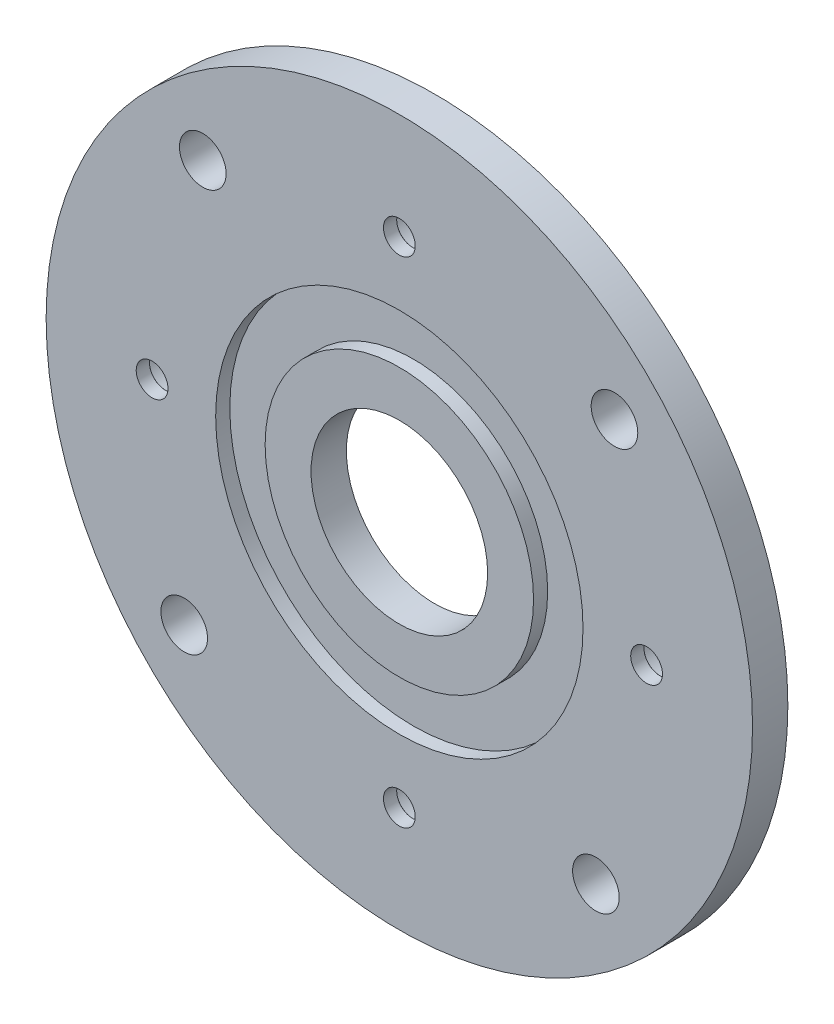
ISO-10303-21;
HEADER;
FILE_DESCRIPTION(('STEP AP214'),'2;1');
FILE_NAME('part.step','',(''),(''),'','','');
FILE_SCHEMA(('AUTOMOTIVE_DESIGN { 1 0 10303 214 1 1 1 1 }'));
ENDSEC;
DATA;
#1=APPLICATION_CONTEXT('core data for automotive mechanical design processes');
#2=APPLICATION_PROTOCOL_DEFINITION('international standard','automotive_design',2000,#1);
#3=PRODUCT_CONTEXT('',#1,'mechanical');
#4=PRODUCT('Part','Part','',(#3));
#5=PRODUCT_RELATED_PRODUCT_CATEGORY('part','',(#4));
#6=PRODUCT_DEFINITION_FORMATION('','',#4);
#7=PRODUCT_DEFINITION_CONTEXT('part definition',#1,'design');
#8=PRODUCT_DEFINITION('design','',#6,#7);
#9=PRODUCT_DEFINITION_SHAPE('','',#8);
#10=(LENGTH_UNIT() NAMED_UNIT(*) SI_UNIT(.MILLI.,.METRE.));
#11=(NAMED_UNIT(*) PLANE_ANGLE_UNIT() SI_UNIT($,.RADIAN.));
#12=(NAMED_UNIT(*) SI_UNIT($,.STERADIAN.) SOLID_ANGLE_UNIT());
#13=UNCERTAINTY_MEASURE_WITH_UNIT(LENGTH_MEASURE(1.E-05),#10,'distance_accuracy_value','');
#14=(GEOMETRIC_REPRESENTATION_CONTEXT(3) GLOBAL_UNCERTAINTY_ASSIGNED_CONTEXT((#13)) GLOBAL_UNIT_ASSIGNED_CONTEXT((#10,
#11,#12)) REPRESENTATION_CONTEXT('',''));
#15=CARTESIAN_POINT('',(0.,0.,0.));
#16=DIRECTION('',(0.,0.,1.));
#17=DIRECTION('',(1.,0.,0.));
#18=AXIS2_PLACEMENT_3D('',#15,#16,#17);
#19=CARTESIAN_POINT('',(0.,0.,5.));
#20=DIRECTION('',(0.,0.,-1.));
#21=DIRECTION('',(-1.,0.,0.));
#22=AXIS2_PLACEMENT_3D('',#19,#20,#21);
#23=CYLINDRICAL_SURFACE('',#22,50.);
#24=CARTESIAN_POINT('',(0.,0.,5.));
#25=DIRECTION('',(0.,0.,1.));
#26=DIRECTION('',(1.,0.,0.));
#27=AXIS2_PLACEMENT_3D('',#24,#25,#26);
#28=CIRCLE('',#27,50.);
#29=CARTESIAN_POINT('',(50.,0.,5.));
#30=VERTEX_POINT('',#29);
#31=EDGE_CURVE('E10',#30,#30,#28,.T.);
#32=ORIENTED_EDGE('',*,*,#31,.F.);
#33=EDGE_LOOP('',(#32));
#34=FACE_BOUND('',#33,.T.);
#35=CARTESIAN_POINT('',(0.,0.,0.));
#36=DIRECTION('',(0.,0.,1.));
#37=DIRECTION('',(1.,0.,0.));
#38=AXIS2_PLACEMENT_3D('',#35,#36,#37);
#39=CIRCLE('',#38,50.);
#40=CARTESIAN_POINT('',(50.,0.,0.));
#41=VERTEX_POINT('',#40);
#42=EDGE_CURVE('E36',#41,#41,#39,.T.);
#43=ORIENTED_EDGE('',*,*,#42,.T.);
#44=EDGE_LOOP('',(#43));
#45=FACE_BOUND('',#44,.T.);
#46=ADVANCED_FACE('F33',(#34,#45),#23,.T.);
#47=CARTESIAN_POINT('',(0.,0.,5.));
#48=DIRECTION('',(0.,0.,1.));
#49=DIRECTION('',(1.,0.,0.));
#50=AXIS2_PLACEMENT_3D('',#47,#48,#49);
#51=PLANE('',#50);
#52=CARTESIAN_POINT('',(30.4526604909076,27.8244131838484,5.));
#53=DIRECTION('',(0.,0.,1.));
#54=DIRECTION('',(1.,0.,0.));
#55=AXIS2_PLACEMENT_3D('',#52,#53,#54);
#56=CIRCLE('',#55,3.29999999999998);
#57=CARTESIAN_POINT('',(33.7526604909076,27.8244131838484,5.));
#58=VERTEX_POINT('',#57);
#59=EDGE_CURVE('E143',#58,#58,#56,.T.);
#60=ORIENTED_EDGE('',*,*,#59,.F.);
#61=EDGE_LOOP('',(#60));
#62=FACE_BOUND('',#61,.T.);
#63=CARTESIAN_POINT('',(-27.8244131838484,30.4526604909076,5.));
#64=DIRECTION('',(0.,0.,1.));
#65=DIRECTION('',(1.,0.,0.));
#66=AXIS2_PLACEMENT_3D('',#63,#64,#65);
#67=CIRCLE('',#66,3.29999999999999);
#68=CARTESIAN_POINT('',(-24.5244131838484,30.4526604909076,5.));
#69=VERTEX_POINT('',#68);
#70=EDGE_CURVE('E137',#69,#69,#67,.T.);
#71=ORIENTED_EDGE('',*,*,#70,.F.);
#72=EDGE_LOOP('',(#71));
#73=FACE_BOUND('',#72,.T.);
#74=CARTESIAN_POINT('',(-30.4526604909076,-27.8244131838484,5.));
#75=DIRECTION('',(0.,0.,1.));
#76=DIRECTION('',(1.,0.,0.));
#77=AXIS2_PLACEMENT_3D('',#74,#75,#76);
#78=CIRCLE('',#77,3.29999999999999);
#79=CARTESIAN_POINT('',(-27.1526604909076,-27.8244131838484,5.));
#80=VERTEX_POINT('',#79);
#81=EDGE_CURVE('E131',#80,#80,#78,.T.);
#82=ORIENTED_EDGE('',*,*,#81,.F.);
#83=EDGE_LOOP('',(#82));
#84=FACE_BOUND('',#83,.T.);
#85=CARTESIAN_POINT('',(27.8244131838484,-30.4526604909076,5.));
#86=DIRECTION('',(0.,0.,1.));
#87=DIRECTION('',(1.,0.,0.));
#88=AXIS2_PLACEMENT_3D('',#85,#86,#87);
#89=CIRCLE('',#88,3.29999999999999);
#90=CARTESIAN_POINT('',(31.1244131838484,-30.4526604909076,5.));
#91=VERTEX_POINT('',#90);
#92=EDGE_CURVE('E125',#91,#91,#89,.T.);
#93=ORIENTED_EDGE('',*,*,#92,.F.);
#94=EDGE_LOOP('',(#93));
#95=FACE_BOUND('',#94,.T.);
#96=CARTESIAN_POINT('',(0.,35.,5.));
#97=DIRECTION('',(0.,0.,-1.));
#98=DIRECTION('',(-1.,0.,0.));
#99=AXIS2_PLACEMENT_3D('',#96,#97,#98);
#100=CIRCLE('',#99,2.25);
#101=CARTESIAN_POINT('',(-2.25,35.,5.));
#102=VERTEX_POINT('',#101);
#103=EDGE_CURVE('E107',#102,#102,#100,.T.);
#104=ORIENTED_EDGE('',*,*,#103,.T.);
#105=EDGE_LOOP('',(#104));
#106=FACE_BOUND('',#105,.T.);
#107=CARTESIAN_POINT('',(-35.,0.,5.));
#108=DIRECTION('',(0.,0.,-1.));
#109=DIRECTION('',(-1.,0.,0.));
#110=AXIS2_PLACEMENT_3D('',#107,#108,#109);
#111=CIRCLE('',#110,2.25);
#112=CARTESIAN_POINT('',(-37.25,0.,5.));
#113=VERTEX_POINT('',#112);
#114=EDGE_CURVE('E92',#113,#113,#111,.T.);
#115=ORIENTED_EDGE('',*,*,#114,.T.);
#116=EDGE_LOOP('',(#115));
#117=FACE_BOUND('',#116,.T.);
#118=CARTESIAN_POINT('',(0.,-35.,5.));
#119=DIRECTION('',(0.,0.,-1.));
#120=DIRECTION('',(-1.,0.,0.));
#121=AXIS2_PLACEMENT_3D('',#118,#119,#120);
#122=CIRCLE('',#121,2.25);
#123=CARTESIAN_POINT('',(-2.25,-35.,5.));
#124=VERTEX_POINT('',#123);
#125=EDGE_CURVE('E77',#124,#124,#122,.T.);
#126=ORIENTED_EDGE('',*,*,#125,.T.);
#127=EDGE_LOOP('',(#126));
#128=FACE_BOUND('',#127,.T.);
#129=CARTESIAN_POINT('',(35.,0.,5.));
#130=DIRECTION('',(0.,0.,-1.));
#131=DIRECTION('',(-1.,0.,0.));
#132=AXIS2_PLACEMENT_3D('',#129,#130,#131);
#133=CIRCLE('',#132,2.25);
#134=CARTESIAN_POINT('',(32.75,0.,5.));
#135=VERTEX_POINT('',#134);
#136=EDGE_CURVE('E60',#135,#135,#133,.T.);
#137=ORIENTED_EDGE('',*,*,#136,.T.);
#138=EDGE_LOOP('',(#137));
#139=FACE_BOUND('',#138,.T.);
#140=CARTESIAN_POINT('',(0.,0.,5.));
#141=DIRECTION('',(0.,0.,1.));
#142=DIRECTION('',(1.,0.,0.));
#143=AXIS2_PLACEMENT_3D('',#140,#141,#142);
#144=CIRCLE('',#143,26.);
#145=CARTESIAN_POINT('',(26.,0.,5.));
#146=VERTEX_POINT('',#145);
#147=EDGE_CURVE('E45',#146,#146,#144,.T.);
#148=ORIENTED_EDGE('',*,*,#147,.F.);
#149=EDGE_LOOP('',(#148));
#150=FACE_BOUND('',#149,.T.);
#151=ORIENTED_EDGE('',*,*,#31,.T.);
#152=EDGE_LOOP('',(#151));
#153=FACE_BOUND('',#152,.T.);
#154=ADVANCED_FACE('F149',(#62,#73,#84,#95,#106,#117,#128,#139,#150,#153),#51,.T.);
#155=CARTESIAN_POINT('',(0.,0.,0.));
#156=DIRECTION('',(0.,0.,1.));
#157=DIRECTION('',(1.,0.,0.));
#158=AXIS2_PLACEMENT_3D('',#155,#156,#157);
#159=PLANE('',#158);
#160=CARTESIAN_POINT('',(30.4526604909076,27.8244131838484,0.));
#161=DIRECTION('',(0.,0.,1.));
#162=DIRECTION('',(1.,0.,0.));
#163=AXIS2_PLACEMENT_3D('',#160,#161,#162);
#164=CIRCLE('',#163,3.29999999999998);
#165=CARTESIAN_POINT('',(33.7526604909076,27.8244131838484,0.));
#166=VERTEX_POINT('',#165);
#167=EDGE_CURVE('E140',#166,#166,#164,.T.);
#168=ORIENTED_EDGE('',*,*,#167,.T.);
#169=EDGE_LOOP('',(#168));
#170=FACE_BOUND('',#169,.T.);
#171=CARTESIAN_POINT('',(-27.8244131838484,30.4526604909076,0.));
#172=DIRECTION('',(0.,0.,1.));
#173=DIRECTION('',(1.,0.,0.));
#174=AXIS2_PLACEMENT_3D('',#171,#172,#173);
#175=CIRCLE('',#174,3.29999999999999);
#176=CARTESIAN_POINT('',(-24.5244131838484,30.4526604909076,0.));
#177=VERTEX_POINT('',#176);
#178=EDGE_CURVE('E134',#177,#177,#175,.T.);
#179=ORIENTED_EDGE('',*,*,#178,.T.);
#180=EDGE_LOOP('',(#179));
#181=FACE_BOUND('',#180,.T.);
#182=CARTESIAN_POINT('',(-30.4526604909076,-27.8244131838484,0.));
#183=DIRECTION('',(0.,0.,1.));
#184=DIRECTION('',(1.,0.,0.));
#185=AXIS2_PLACEMENT_3D('',#182,#183,#184);
#186=CIRCLE('',#185,3.29999999999999);
#187=CARTESIAN_POINT('',(-27.1526604909076,-27.8244131838484,0.));
#188=VERTEX_POINT('',#187);
#189=EDGE_CURVE('E128',#188,#188,#186,.T.);
#190=ORIENTED_EDGE('',*,*,#189,.T.);
#191=EDGE_LOOP('',(#190));
#192=FACE_BOUND('',#191,.T.);
#193=CARTESIAN_POINT('',(27.8244131838484,-30.4526604909076,0.));
#194=DIRECTION('',(0.,0.,1.));
#195=DIRECTION('',(1.,0.,0.));
#196=AXIS2_PLACEMENT_3D('',#193,#194,#195);
#197=CIRCLE('',#196,3.29999999999999);
#198=CARTESIAN_POINT('',(31.1244131838484,-30.4526604909076,0.));
#199=VERTEX_POINT('',#198);
#200=EDGE_CURVE('E122',#199,#199,#197,.T.);
#201=ORIENTED_EDGE('',*,*,#200,.T.);
#202=EDGE_LOOP('',(#201));
#203=FACE_BOUND('',#202,.T.);
#204=CARTESIAN_POINT('',(0.,35.,0.));
#205=DIRECTION('',(0.,0.,-1.));
#206=DIRECTION('',(-1.,0.,0.));
#207=AXIS2_PLACEMENT_3D('',#204,#205,#206);
#208=CIRCLE('',#207,4.5);
#209=CARTESIAN_POINT('',(-4.5,35.,0.));
#210=VERTEX_POINT('',#209);
#211=EDGE_CURVE('E119',#210,#210,#208,.T.);
#212=ORIENTED_EDGE('',*,*,#211,.F.);
#213=EDGE_LOOP('',(#212));
#214=FACE_BOUND('',#213,.T.);
#215=CARTESIAN_POINT('',(-35.,0.,0.));
#216=DIRECTION('',(0.,0.,-1.));
#217=DIRECTION('',(-1.,0.,0.));
#218=AXIS2_PLACEMENT_3D('',#215,#216,#217);
#219=CIRCLE('',#218,4.5);
#220=CARTESIAN_POINT('',(-39.5,0.,0.));
#221=VERTEX_POINT('',#220);
#222=EDGE_CURVE('E104',#221,#221,#219,.T.);
#223=ORIENTED_EDGE('',*,*,#222,.F.);
#224=EDGE_LOOP('',(#223));
#225=FACE_BOUND('',#224,.T.);
#226=CARTESIAN_POINT('',(0.,-35.,0.));
#227=DIRECTION('',(0.,0.,-1.));
#228=DIRECTION('',(-1.,0.,0.));
#229=AXIS2_PLACEMENT_3D('',#226,#227,#228);
#230=CIRCLE('',#229,4.5);
#231=CARTESIAN_POINT('',(-4.5,-35.,0.));
#232=VERTEX_POINT('',#231);
#233=EDGE_CURVE('E89',#232,#232,#230,.T.);
#234=ORIENTED_EDGE('',*,*,#233,.F.);
#235=EDGE_LOOP('',(#234));
#236=FACE_BOUND('',#235,.T.);
#237=CARTESIAN_POINT('',(35.,0.,0.));
#238=DIRECTION('',(0.,0.,-1.));
#239=DIRECTION('',(-1.,0.,0.));
#240=AXIS2_PLACEMENT_3D('',#237,#238,#239);
#241=CIRCLE('',#240,4.5);
#242=CARTESIAN_POINT('',(30.5,0.,0.));
#243=VERTEX_POINT('',#242);
#244=EDGE_CURVE('E74',#243,#243,#241,.T.);
#245=ORIENTED_EDGE('',*,*,#244,.F.);
#246=EDGE_LOOP('',(#245));
#247=FACE_BOUND('',#246,.T.);
#248=CARTESIAN_POINT('',(0.,0.,0.));
#249=DIRECTION('',(0.,0.,1.));
#250=DIRECTION('',(1.,0.,0.));
#251=AXIS2_PLACEMENT_3D('',#248,#249,#250);
#252=CIRCLE('',#251,12.5);
#253=CARTESIAN_POINT('',(12.5,0.,0.));
#254=VERTEX_POINT('',#253);
#255=EDGE_CURVE('E54',#254,#254,#252,.T.);
#256=ORIENTED_EDGE('',*,*,#255,.T.);
#257=EDGE_LOOP('',(#256));
#258=FACE_BOUND('',#257,.T.);
#259=ORIENTED_EDGE('',*,*,#42,.F.);
#260=EDGE_LOOP('',(#259));
#261=FACE_BOUND('',#260,.T.);
#262=ADVANCED_FACE('F152',(#170,#181,#192,#203,#214,#225,#236,#247,#258,#261),#159,.F.);
#263=CARTESIAN_POINT('',(0.,0.,3.));
#264=DIRECTION('',(0.,0.,1.));
#265=DIRECTION('',(1.,0.,0.));
#266=AXIS2_PLACEMENT_3D('',#263,#264,#265);
#267=CYLINDRICAL_SURFACE('',#266,26.);
#268=CARTESIAN_POINT('',(0.,0.,3.));
#269=DIRECTION('',(0.,0.,1.));
#270=DIRECTION('',(1.,0.,0.));
#271=AXIS2_PLACEMENT_3D('',#268,#269,#270);
#272=CIRCLE('',#271,26.);
#273=CARTESIAN_POINT('',(26.,0.,3.));
#274=VERTEX_POINT('',#273);
#275=EDGE_CURVE('E43',#274,#274,#272,.T.);
#276=ORIENTED_EDGE('',*,*,#275,.F.);
#277=EDGE_LOOP('',(#276));
#278=FACE_BOUND('',#277,.T.);
#279=ORIENTED_EDGE('',*,*,#147,.T.);
#280=EDGE_LOOP('',(#279));
#281=FACE_BOUND('',#280,.T.);
#282=ADVANCED_FACE('F171',(#278,#281),#267,.F.);
#283=CARTESIAN_POINT('',(0.,0.,3.));
#284=DIRECTION('',(0.,0.,1.));
#285=DIRECTION('',(1.,0.,0.));
#286=AXIS2_PLACEMENT_3D('',#283,#284,#285);
#287=PLANE('',#286);
#288=CARTESIAN_POINT('',(0.,0.,3.));
#289=DIRECTION('',(0.,0.,1.));
#290=DIRECTION('',(1.,0.,0.));
#291=AXIS2_PLACEMENT_3D('',#288,#289,#290);
#292=CIRCLE('',#291,19.);
#293=CARTESIAN_POINT('',(19.,0.,3.));
#294=VERTEX_POINT('',#293);
#295=EDGE_CURVE('E48',#294,#294,#292,.T.);
#296=ORIENTED_EDGE('',*,*,#295,.F.);
#297=EDGE_LOOP('',(#296));
#298=FACE_BOUND('',#297,.T.);
#299=ORIENTED_EDGE('',*,*,#275,.T.);
#300=EDGE_LOOP('',(#299));
#301=FACE_BOUND('',#300,.T.);
#302=ADVANCED_FACE('F173',(#298,#301),#287,.T.);
#303=CARTESIAN_POINT('',(0.,0.,3.));
#304=DIRECTION('',(0.,0.,1.));
#305=DIRECTION('',(1.,0.,0.));
#306=AXIS2_PLACEMENT_3D('',#303,#304,#305);
#307=CYLINDRICAL_SURFACE('',#306,19.);
#308=ORIENTED_EDGE('',*,*,#295,.T.);
#309=EDGE_LOOP('',(#308));
#310=FACE_BOUND('',#309,.T.);
#311=CARTESIAN_POINT('',(0.,0.,5.));
#312=DIRECTION('',(0.,0.,1.));
#313=DIRECTION('',(1.,0.,0.));
#314=AXIS2_PLACEMENT_3D('',#311,#312,#313);
#315=CIRCLE('',#314,19.);
#316=CARTESIAN_POINT('',(19.,0.,5.));
#317=VERTEX_POINT('',#316);
#318=EDGE_CURVE('E51',#317,#317,#315,.T.);
#319=ORIENTED_EDGE('',*,*,#318,.F.);
#320=EDGE_LOOP('',(#319));
#321=FACE_BOUND('',#320,.T.);
#322=ADVANCED_FACE('F180',(#310,#321),#307,.T.);
#323=CARTESIAN_POINT('',(0.,0.,5.));
#324=DIRECTION('',(0.,0.,1.));
#325=DIRECTION('',(1.,0.,0.));
#326=AXIS2_PLACEMENT_3D('',#323,#324,#325);
#327=CIRCLE('',#326,12.5);
#328=CARTESIAN_POINT('',(12.5,0.,5.));
#329=VERTEX_POINT('',#328);
#330=EDGE_CURVE('E57',#329,#329,#327,.T.);
#331=ORIENTED_EDGE('',*,*,#330,.F.);
#332=EDGE_LOOP('',(#331));
#333=FACE_BOUND('',#332,.T.);
#334=ORIENTED_EDGE('',*,*,#318,.T.);
#335=EDGE_LOOP('',(#334));
#336=FACE_BOUND('',#335,.T.);
#337=ADVANCED_FACE('F154',(#333,#336),#51,.T.);
#338=CARTESIAN_POINT('',(0.,0.,0.));
#339=DIRECTION('',(0.,0.,1.));
#340=DIRECTION('',(1.,0.,0.));
#341=AXIS2_PLACEMENT_3D('',#338,#339,#340);
#342=CYLINDRICAL_SURFACE('',#341,12.5);
#343=ORIENTED_EDGE('',*,*,#255,.F.);
#344=EDGE_LOOP('',(#343));
#345=FACE_BOUND('',#344,.T.);
#346=ORIENTED_EDGE('',*,*,#330,.T.);
#347=EDGE_LOOP('',(#346));
#348=FACE_BOUND('',#347,.T.);
#349=ADVANCED_FACE('F311',(#345,#348),#342,.F.);
#350=CARTESIAN_POINT('',(35.,0.,0.));
#351=DIRECTION('',(0.,0.,-1.));
#352=DIRECTION('',(-1.,0.,0.));
#353=AXIS2_PLACEMENT_3D('',#350,#351,#352);
#354=CYLINDRICAL_SURFACE('',#353,2.25);
#355=ORIENTED_EDGE('',*,*,#136,.F.);
#356=EDGE_LOOP('',(#355));
#357=FACE_BOUND('',#356,.T.);
#358=CARTESIAN_POINT('',(35.,0.,3.125));
#359=DIRECTION('',(0.,0.,-1.));
#360=DIRECTION('',(-1.,0.,0.));
#361=AXIS2_PLACEMENT_3D('',#358,#359,#360);
#362=CIRCLE('',#361,2.25);
#363=CARTESIAN_POINT('',(32.75,0.,3.125));
#364=VERTEX_POINT('',#363);
#365=EDGE_CURVE('E65',#364,#364,#362,.T.);
#366=ORIENTED_EDGE('',*,*,#365,.T.);
#367=EDGE_LOOP('',(#366));
#368=FACE_BOUND('',#367,.T.);
#369=ADVANCED_FACE('F307',(#357,#368),#354,.F.);
#370=CARTESIAN_POINT('',(35.,0.,3.1));
#371=DIRECTION('',(0.,0.,-1.));
#372=DIRECTION('',(-1.,0.,0.));
#373=AXIS2_PLACEMENT_3D('',#370,#371,#372);
#374=CONICAL_SURFACE('',#373,2.275,0.785398163397396);
#375=ORIENTED_EDGE('',*,*,#365,.F.);
#376=EDGE_LOOP('',(#375));
#377=FACE_BOUND('',#376,.T.);
#378=CARTESIAN_POINT('',(35.,0.,3.1));
#379=DIRECTION('',(0.,0.,-1.));
#380=DIRECTION('',(-1.,0.,0.));
#381=AXIS2_PLACEMENT_3D('',#378,#379,#380);
#382=CIRCLE('',#381,2.275);
#383=CARTESIAN_POINT('',(32.725,0.,3.1));
#384=VERTEX_POINT('',#383);
#385=EDGE_CURVE('E68',#384,#384,#382,.T.);
#386=ORIENTED_EDGE('',*,*,#385,.T.);
#387=EDGE_LOOP('',(#386));
#388=FACE_BOUND('',#387,.T.);
#389=ADVANCED_FACE('F303',(#377,#388),#374,.F.);
#390=CARTESIAN_POINT('',(37.275,0.,3.1));
#391=DIRECTION('',(0.,0.,1.));
#392=DIRECTION('',(1.,0.,0.));
#393=AXIS2_PLACEMENT_3D('',#390,#391,#392);
#394=PLANE('',#393);
#395=ORIENTED_EDGE('',*,*,#385,.F.);
#396=EDGE_LOOP('',(#395));
#397=FACE_BOUND('',#396,.T.);
#398=CARTESIAN_POINT('',(35.,0.,3.1));
#399=DIRECTION('',(0.,0.,-1.));
#400=DIRECTION('',(-1.,0.,0.));
#401=AXIS2_PLACEMENT_3D('',#398,#399,#400);
#402=CIRCLE('',#401,4.5);
#403=CARTESIAN_POINT('',(30.5,0.,3.1));
#404=VERTEX_POINT('',#403);
#405=EDGE_CURVE('E71',#404,#404,#402,.T.);
#406=ORIENTED_EDGE('',*,*,#405,.T.);
#407=EDGE_LOOP('',(#406));
#408=FACE_BOUND('',#407,.T.);
#409=ADVANCED_FACE('F299',(#397,#408),#394,.F.);
#410=CARTESIAN_POINT('',(35.,0.,0.));
#411=DIRECTION('',(0.,0.,-1.));
#412=DIRECTION('',(-1.,0.,0.));
#413=AXIS2_PLACEMENT_3D('',#410,#411,#412);
#414=CYLINDRICAL_SURFACE('',#413,4.5);
#415=ORIENTED_EDGE('',*,*,#405,.F.);
#416=EDGE_LOOP('',(#415));
#417=FACE_BOUND('',#416,.T.);
#418=ORIENTED_EDGE('',*,*,#244,.T.);
#419=EDGE_LOOP('',(#418));
#420=FACE_BOUND('',#419,.T.);
#421=ADVANCED_FACE('F295',(#417,#420),#414,.F.);
#422=CARTESIAN_POINT('',(0.,-35.,0.));
#423=DIRECTION('',(0.,0.,-1.));
#424=DIRECTION('',(-1.,0.,0.));
#425=AXIS2_PLACEMENT_3D('',#422,#423,#424);
#426=CYLINDRICAL_SURFACE('',#425,2.25);
#427=ORIENTED_EDGE('',*,*,#125,.F.);
#428=EDGE_LOOP('',(#427));
#429=FACE_BOUND('',#428,.T.);
#430=CARTESIAN_POINT('',(0.,-35.,3.125));
#431=DIRECTION('',(0.,0.,-1.));
#432=DIRECTION('',(-1.,0.,0.));
#433=AXIS2_PLACEMENT_3D('',#430,#431,#432);
#434=CIRCLE('',#433,2.25);
#435=CARTESIAN_POINT('',(-2.25,-35.,3.125));
#436=VERTEX_POINT('',#435);
#437=EDGE_CURVE('E80',#436,#436,#434,.T.);
#438=ORIENTED_EDGE('',*,*,#437,.T.);
#439=EDGE_LOOP('',(#438));
#440=FACE_BOUND('',#439,.T.);
#441=ADVANCED_FACE('F291',(#429,#440),#426,.F.);
#442=CARTESIAN_POINT('',(0.,-35.,3.1));
#443=DIRECTION('',(0.,0.,-1.));
#444=DIRECTION('',(-1.,0.,0.));
#445=AXIS2_PLACEMENT_3D('',#442,#443,#444);
#446=CONICAL_SURFACE('',#445,2.275,0.785398163397448);
#447=ORIENTED_EDGE('',*,*,#437,.F.);
#448=EDGE_LOOP('',(#447));
#449=FACE_BOUND('',#448,.T.);
#450=CARTESIAN_POINT('',(0.,-35.,3.1));
#451=DIRECTION('',(0.,0.,-1.));
#452=DIRECTION('',(-1.,0.,0.));
#453=AXIS2_PLACEMENT_3D('',#450,#451,#452);
#454=CIRCLE('',#453,2.275);
#455=CARTESIAN_POINT('',(-2.275,-35.,3.1));
#456=VERTEX_POINT('',#455);
#457=EDGE_CURVE('E83',#456,#456,#454,.T.);
#458=ORIENTED_EDGE('',*,*,#457,.T.);
#459=EDGE_LOOP('',(#458));
#460=FACE_BOUND('',#459,.T.);
#461=ADVANCED_FACE('F287',(#449,#460),#446,.F.);
#462=CARTESIAN_POINT('',(2.275,-35.,3.1));
#463=DIRECTION('',(0.,0.,1.));
#464=DIRECTION('',(1.,0.,0.));
#465=AXIS2_PLACEMENT_3D('',#462,#463,#464);
#466=PLANE('',#465);
#467=ORIENTED_EDGE('',*,*,#457,.F.);
#468=EDGE_LOOP('',(#467));
#469=FACE_BOUND('',#468,.T.);
#470=CARTESIAN_POINT('',(0.,-35.,3.1));
#471=DIRECTION('',(0.,0.,-1.));
#472=DIRECTION('',(-1.,0.,0.));
#473=AXIS2_PLACEMENT_3D('',#470,#471,#472);
#474=CIRCLE('',#473,4.5);
#475=CARTESIAN_POINT('',(-4.5,-35.,3.1));
#476=VERTEX_POINT('',#475);
#477=EDGE_CURVE('E86',#476,#476,#474,.T.);
#478=ORIENTED_EDGE('',*,*,#477,.T.);
#479=EDGE_LOOP('',(#478));
#480=FACE_BOUND('',#479,.T.);
#481=ADVANCED_FACE('F283',(#469,#480),#466,.F.);
#482=CARTESIAN_POINT('',(0.,-35.,0.));
#483=DIRECTION('',(0.,0.,-1.));
#484=DIRECTION('',(-1.,0.,0.));
#485=AXIS2_PLACEMENT_3D('',#482,#483,#484);
#486=CYLINDRICAL_SURFACE('',#485,4.5);
#487=ORIENTED_EDGE('',*,*,#477,.F.);
#488=EDGE_LOOP('',(#487));
#489=FACE_BOUND('',#488,.T.);
#490=ORIENTED_EDGE('',*,*,#233,.T.);
#491=EDGE_LOOP('',(#490));
#492=FACE_BOUND('',#491,.T.);
#493=ADVANCED_FACE('F279',(#489,#492),#486,.F.);
#494=CARTESIAN_POINT('',(-35.,0.,0.));
#495=DIRECTION('',(0.,0.,-1.));
#496=DIRECTION('',(-1.,0.,0.));
#497=AXIS2_PLACEMENT_3D('',#494,#495,#496);
#498=CYLINDRICAL_SURFACE('',#497,2.25);
#499=ORIENTED_EDGE('',*,*,#114,.F.);
#500=EDGE_LOOP('',(#499));
#501=FACE_BOUND('',#500,.T.);
#502=CARTESIAN_POINT('',(-35.,0.,3.125));
#503=DIRECTION('',(0.,0.,-1.));
#504=DIRECTION('',(-1.,0.,0.));
#505=AXIS2_PLACEMENT_3D('',#502,#503,#504);
#506=CIRCLE('',#505,2.25);
#507=CARTESIAN_POINT('',(-37.25,0.,3.125));
#508=VERTEX_POINT('',#507);
#509=EDGE_CURVE('E95',#508,#508,#506,.T.);
#510=ORIENTED_EDGE('',*,*,#509,.T.);
#511=EDGE_LOOP('',(#510));
#512=FACE_BOUND('',#511,.T.);
#513=ADVANCED_FACE('F275',(#501,#512),#498,.F.);
#514=CARTESIAN_POINT('',(-35.,0.,3.1));
#515=DIRECTION('',(0.,0.,-1.));
#516=DIRECTION('',(-1.,0.,0.));
#517=AXIS2_PLACEMENT_3D('',#514,#515,#516);
#518=CONICAL_SURFACE('',#517,2.275,0.785398163397396);
#519=ORIENTED_EDGE('',*,*,#509,.F.);
#520=EDGE_LOOP('',(#519));
#521=FACE_BOUND('',#520,.T.);
#522=CARTESIAN_POINT('',(-35.,0.,3.1));
#523=DIRECTION('',(0.,0.,-1.));
#524=DIRECTION('',(-1.,0.,0.));
#525=AXIS2_PLACEMENT_3D('',#522,#523,#524);
#526=CIRCLE('',#525,2.275);
#527=CARTESIAN_POINT('',(-37.275,0.,3.1));
#528=VERTEX_POINT('',#527);
#529=EDGE_CURVE('E98',#528,#528,#526,.T.);
#530=ORIENTED_EDGE('',*,*,#529,.T.);
#531=EDGE_LOOP('',(#530));
#532=FACE_BOUND('',#531,.T.);
#533=ADVANCED_FACE('F271',(#521,#532),#518,.F.);
#534=CARTESIAN_POINT('',(-32.725,0.,3.1));
#535=DIRECTION('',(0.,0.,1.));
#536=DIRECTION('',(1.,0.,0.));
#537=AXIS2_PLACEMENT_3D('',#534,#535,#536);
#538=PLANE('',#537);
#539=ORIENTED_EDGE('',*,*,#529,.F.);
#540=EDGE_LOOP('',(#539));
#541=FACE_BOUND('',#540,.T.);
#542=CARTESIAN_POINT('',(-35.,0.,3.1));
#543=DIRECTION('',(0.,0.,-1.));
#544=DIRECTION('',(-1.,0.,0.));
#545=AXIS2_PLACEMENT_3D('',#542,#543,#544);
#546=CIRCLE('',#545,4.5);
#547=CARTESIAN_POINT('',(-39.5,0.,3.1));
#548=VERTEX_POINT('',#547);
#549=EDGE_CURVE('E101',#548,#548,#546,.T.);
#550=ORIENTED_EDGE('',*,*,#549,.T.);
#551=EDGE_LOOP('',(#550));
#552=FACE_BOUND('',#551,.T.);
#553=ADVANCED_FACE('F267',(#541,#552),#538,.F.);
#554=CARTESIAN_POINT('',(-35.,0.,0.));
#555=DIRECTION('',(0.,0.,-1.));
#556=DIRECTION('',(-1.,0.,0.));
#557=AXIS2_PLACEMENT_3D('',#554,#555,#556);
#558=CYLINDRICAL_SURFACE('',#557,4.5);
#559=ORIENTED_EDGE('',*,*,#549,.F.);
#560=EDGE_LOOP('',(#559));
#561=FACE_BOUND('',#560,.T.);
#562=ORIENTED_EDGE('',*,*,#222,.T.);
#563=EDGE_LOOP('',(#562));
#564=FACE_BOUND('',#563,.T.);
#565=ADVANCED_FACE('F263',(#561,#564),#558,.F.);
#566=CARTESIAN_POINT('',(0.,35.,0.));
#567=DIRECTION('',(0.,0.,-1.));
#568=DIRECTION('',(-1.,0.,0.));
#569=AXIS2_PLACEMENT_3D('',#566,#567,#568);
#570=CYLINDRICAL_SURFACE('',#569,2.25);
#571=ORIENTED_EDGE('',*,*,#103,.F.);
#572=EDGE_LOOP('',(#571));
#573=FACE_BOUND('',#572,.T.);
#574=CARTESIAN_POINT('',(0.,35.,3.125));
#575=DIRECTION('',(0.,0.,-1.));
#576=DIRECTION('',(-1.,0.,0.));
#577=AXIS2_PLACEMENT_3D('',#574,#575,#576);
#578=CIRCLE('',#577,2.25);
#579=CARTESIAN_POINT('',(-2.25,35.,3.125));
#580=VERTEX_POINT('',#579);
#581=EDGE_CURVE('E110',#580,#580,#578,.T.);
#582=ORIENTED_EDGE('',*,*,#581,.T.);
#583=EDGE_LOOP('',(#582));
#584=FACE_BOUND('',#583,.T.);
#585=ADVANCED_FACE('F259',(#573,#584),#570,.F.);
#586=CARTESIAN_POINT('',(0.,35.,3.1));
#587=DIRECTION('',(0.,0.,-1.));
#588=DIRECTION('',(-1.,0.,0.));
#589=AXIS2_PLACEMENT_3D('',#586,#587,#588);
#590=CONICAL_SURFACE('',#589,2.275,0.785398163397448);
#591=ORIENTED_EDGE('',*,*,#581,.F.);
#592=EDGE_LOOP('',(#591));
#593=FACE_BOUND('',#592,.T.);
#594=CARTESIAN_POINT('',(0.,35.,3.1));
#595=DIRECTION('',(0.,0.,-1.));
#596=DIRECTION('',(-1.,0.,0.));
#597=AXIS2_PLACEMENT_3D('',#594,#595,#596);
#598=CIRCLE('',#597,2.275);
#599=CARTESIAN_POINT('',(-2.275,35.,3.1));
#600=VERTEX_POINT('',#599);
#601=EDGE_CURVE('E113',#600,#600,#598,.T.);
#602=ORIENTED_EDGE('',*,*,#601,.T.);
#603=EDGE_LOOP('',(#602));
#604=FACE_BOUND('',#603,.T.);
#605=ADVANCED_FACE('F255',(#593,#604),#590,.F.);
#606=CARTESIAN_POINT('',(2.275,35.,3.1));
#607=DIRECTION('',(0.,0.,1.));
#608=DIRECTION('',(1.,0.,0.));
#609=AXIS2_PLACEMENT_3D('',#606,#607,#608);
#610=PLANE('',#609);
#611=ORIENTED_EDGE('',*,*,#601,.F.);
#612=EDGE_LOOP('',(#611));
#613=FACE_BOUND('',#612,.T.);
#614=CARTESIAN_POINT('',(0.,35.,3.1));
#615=DIRECTION('',(0.,0.,-1.));
#616=DIRECTION('',(-1.,0.,0.));
#617=AXIS2_PLACEMENT_3D('',#614,#615,#616);
#618=CIRCLE('',#617,4.5);
#619=CARTESIAN_POINT('',(-4.5,35.,3.1));
#620=VERTEX_POINT('',#619);
#621=EDGE_CURVE('E116',#620,#620,#618,.T.);
#622=ORIENTED_EDGE('',*,*,#621,.T.);
#623=EDGE_LOOP('',(#622));
#624=FACE_BOUND('',#623,.T.);
#625=ADVANCED_FACE('F251',(#613,#624),#610,.F.);
#626=CARTESIAN_POINT('',(0.,35.,0.));
#627=DIRECTION('',(0.,0.,-1.));
#628=DIRECTION('',(-1.,0.,0.));
#629=AXIS2_PLACEMENT_3D('',#626,#627,#628);
#630=CYLINDRICAL_SURFACE('',#629,4.5);
#631=ORIENTED_EDGE('',*,*,#621,.F.);
#632=EDGE_LOOP('',(#631));
#633=FACE_BOUND('',#632,.T.);
#634=ORIENTED_EDGE('',*,*,#211,.T.);
#635=EDGE_LOOP('',(#634));
#636=FACE_BOUND('',#635,.T.);
#637=ADVANCED_FACE('F213',(#633,#636),#630,.F.);
#638=CARTESIAN_POINT('',(27.8244131838484,-30.4526604909076,5.));
#639=DIRECTION('',(0.,0.,1.));
#640=DIRECTION('',(1.,0.,0.));
#641=AXIS2_PLACEMENT_3D('',#638,#639,#640);
#642=CYLINDRICAL_SURFACE('',#641,3.29999999999999);
#643=ORIENTED_EDGE('',*,*,#200,.F.);
#644=EDGE_LOOP('',(#643));
#645=FACE_BOUND('',#644,.T.);
#646=ORIENTED_EDGE('',*,*,#92,.T.);
#647=EDGE_LOOP('',(#646));
#648=FACE_BOUND('',#647,.T.);
#649=ADVANCED_FACE('F207',(#645,#648),#642,.F.);
#650=CARTESIAN_POINT('',(-30.4526604909076,-27.8244131838484,5.));
#651=DIRECTION('',(0.,0.,1.));
#652=DIRECTION('',(1.,0.,0.));
#653=AXIS2_PLACEMENT_3D('',#650,#651,#652);
#654=CYLINDRICAL_SURFACE('',#653,3.29999999999999);
#655=ORIENTED_EDGE('',*,*,#189,.F.);
#656=EDGE_LOOP('',(#655));
#657=FACE_BOUND('',#656,.T.);
#658=ORIENTED_EDGE('',*,*,#81,.T.);
#659=EDGE_LOOP('',(#658));
#660=FACE_BOUND('',#659,.T.);
#661=ADVANCED_FACE('F212',(#657,#660),#654,.F.);
#662=CARTESIAN_POINT('',(-27.8244131838484,30.4526604909076,5.));
#663=DIRECTION('',(0.,0.,1.));
#664=DIRECTION('',(1.,0.,0.));
#665=AXIS2_PLACEMENT_3D('',#662,#663,#664);
#666=CYLINDRICAL_SURFACE('',#665,3.29999999999999);
#667=ORIENTED_EDGE('',*,*,#178,.F.);
#668=EDGE_LOOP('',(#667));
#669=FACE_BOUND('',#668,.T.);
#670=ORIENTED_EDGE('',*,*,#70,.T.);
#671=EDGE_LOOP('',(#670));
#672=FACE_BOUND('',#671,.T.);
#673=ADVANCED_FACE('F225',(#669,#672),#666,.F.);
#674=CARTESIAN_POINT('',(30.4526604909076,27.8244131838484,5.));
#675=DIRECTION('',(0.,0.,1.));
#676=DIRECTION('',(1.,0.,0.));
#677=AXIS2_PLACEMENT_3D('',#674,#675,#676);
#678=CYLINDRICAL_SURFACE('',#677,3.29999999999998);
#679=ORIENTED_EDGE('',*,*,#167,.F.);
#680=EDGE_LOOP('',(#679));
#681=FACE_BOUND('',#680,.T.);
#682=ORIENTED_EDGE('',*,*,#59,.T.);
#683=EDGE_LOOP('',(#682));
#684=FACE_BOUND('',#683,.T.);
#685=ADVANCED_FACE('F147',(#681,#684),#678,.F.);
#686=CLOSED_SHELL('',(#46,#154,#262,#282,#302,#322,#337,#349,#369,#389,#409,#421,#441,#461,#481,
#493,#513,#533,#553,#565,#585,#605,#625,#637,#649,#661,#673,#685));
#687=MANIFOLD_SOLID_BREP('B2',#686);
#688=ADVANCED_BREP_SHAPE_REPRESENTATION('',(#18,#687),#14);
#689=SHAPE_DEFINITION_REPRESENTATION(#9,#688);
ENDSEC;
END-ISO-10303-21;
